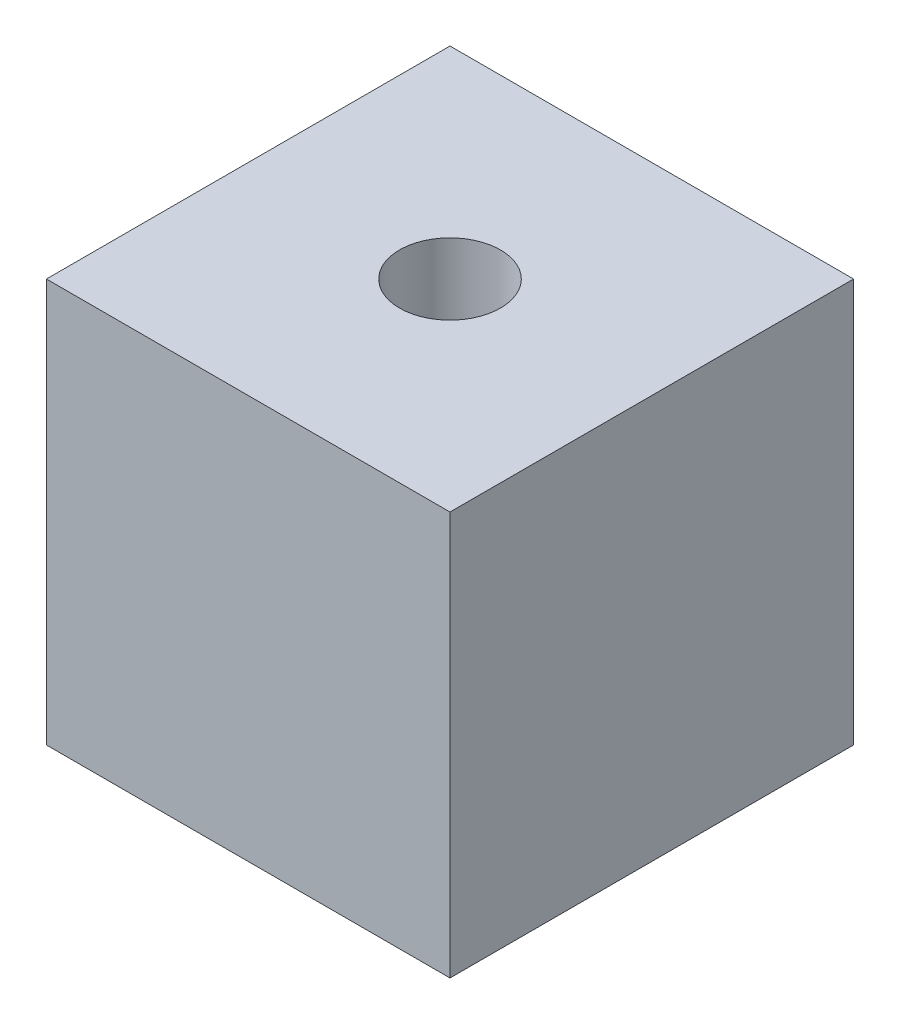
ISO-10303-21;
HEADER;
FILE_DESCRIPTION(('STEP AP214'),'2;1');
FILE_NAME('part.step','',(''),(''),'','','');
FILE_SCHEMA(('AUTOMOTIVE_DESIGN { 1 0 10303 214 1 1 1 1 }'));
ENDSEC;
DATA;
#1=APPLICATION_CONTEXT('core data for automotive mechanical design processes');
#2=APPLICATION_PROTOCOL_DEFINITION('international standard','automotive_design',2000,#1);
#3=PRODUCT_CONTEXT('',#1,'mechanical');
#4=PRODUCT('Part','Part','',(#3));
#5=PRODUCT_RELATED_PRODUCT_CATEGORY('part','',(#4));
#6=PRODUCT_DEFINITION_FORMATION('','',#4);
#7=PRODUCT_DEFINITION_CONTEXT('part definition',#1,'design');
#8=PRODUCT_DEFINITION('design','',#6,#7);
#9=PRODUCT_DEFINITION_SHAPE('','',#8);
#10=(LENGTH_UNIT() NAMED_UNIT(*) SI_UNIT(.MILLI.,.METRE.));
#11=(NAMED_UNIT(*) PLANE_ANGLE_UNIT() SI_UNIT($,.RADIAN.));
#12=(NAMED_UNIT(*) SI_UNIT($,.STERADIAN.) SOLID_ANGLE_UNIT());
#13=UNCERTAINTY_MEASURE_WITH_UNIT(LENGTH_MEASURE(1.E-05),#10,'distance_accuracy_value','');
#14=(GEOMETRIC_REPRESENTATION_CONTEXT(3) GLOBAL_UNCERTAINTY_ASSIGNED_CONTEXT((#13)) GLOBAL_UNIT_ASSIGNED_CONTEXT((#10,
#11,#12)) REPRESENTATION_CONTEXT('',''));
#15=CARTESIAN_POINT('',(0.,0.,0.));
#16=DIRECTION('',(0.,0.,1.));
#17=DIRECTION('',(1.,0.,0.));
#18=AXIS2_PLACEMENT_3D('',#15,#16,#17);
#19=CARTESIAN_POINT('',(0.,20.,0.));
#20=DIRECTION('',(0.,1.,0.));
#21=DIRECTION('',(0.,0.,1.));
#22=AXIS2_PLACEMENT_3D('',#19,#20,#21);
#23=PLANE('',#22);
#24=DIRECTION('',(0.,0.,1.));
#25=VECTOR('',#24,1.);
#26=CARTESIAN_POINT('',(0.,20.,0.));
#27=LINE('',#26,#25);
#28=CARTESIAN_POINT('',(0.,20.,0.));
#29=VERTEX_POINT('',#28);
#30=CARTESIAN_POINT('',(0.,20.,20.));
#31=VERTEX_POINT('',#30);
#32=EDGE_CURVE('E85',#29,#31,#27,.T.);
#33=ORIENTED_EDGE('',*,*,#32,.T.);
#34=DIRECTION('',(1.,0.,0.));
#35=VECTOR('',#34,1.);
#36=CARTESIAN_POINT('',(0.,20.,20.));
#37=LINE('',#36,#35);
#38=CARTESIAN_POINT('',(20.,20.,20.));
#39=VERTEX_POINT('',#38);
#40=EDGE_CURVE('E80',#31,#39,#37,.T.);
#41=ORIENTED_EDGE('',*,*,#40,.T.);
#42=DIRECTION('',(0.,0.,-1.));
#43=VECTOR('',#42,1.);
#44=CARTESIAN_POINT('',(20.,20.,0.));
#45=LINE('',#44,#43);
#46=CARTESIAN_POINT('',(20.,20.,0.));
#47=VERTEX_POINT('',#46);
#48=EDGE_CURVE('E83',#39,#47,#45,.T.);
#49=ORIENTED_EDGE('',*,*,#48,.T.);
#50=DIRECTION('',(-1.,0.,0.));
#51=VECTOR('',#50,1.);
#52=CARTESIAN_POINT('',(0.,20.,0.));
#53=LINE('',#52,#51);
#54=EDGE_CURVE('E50',#47,#29,#53,.T.);
#55=ORIENTED_EDGE('',*,*,#54,.T.);
#56=EDGE_LOOP('',(#33,#41,#49,#55));
#57=FACE_BOUND('',#56,.T.);
#58=CARTESIAN_POINT('',(10.,20.,10.));
#59=DIRECTION('',(0.,1.,0.));
#60=DIRECTION('',(0.,0.,1.));
#61=AXIS2_PLACEMENT_3D('',#58,#59,#60);
#62=CIRCLE('',#61,2.5);
#63=CARTESIAN_POINT('',(10.,20.,12.5));
#64=VERTEX_POINT('',#63);
#65=EDGE_CURVE('E100',#64,#64,#62,.T.);
#66=ORIENTED_EDGE('',*,*,#65,.F.);
#67=EDGE_LOOP('',(#66));
#68=FACE_BOUND('',#67,.T.);
#69=ADVANCED_FACE('F33',(#57,#68),#23,.T.);
#70=CARTESIAN_POINT('',(0.,0.,0.));
#71=DIRECTION('',(0.,1.,0.));
#72=DIRECTION('',(0.,0.,1.));
#73=AXIS2_PLACEMENT_3D('',#70,#71,#72);
#74=PLANE('',#73);
#75=DIRECTION('',(0.,0.,1.));
#76=VECTOR('',#75,1.);
#77=CARTESIAN_POINT('',(0.,0.,0.));
#78=LINE('',#77,#76);
#79=CARTESIAN_POINT('',(0.,0.,0.));
#80=VERTEX_POINT('',#79);
#81=CARTESIAN_POINT('',(0.,0.,20.));
#82=VERTEX_POINT('',#81);
#83=EDGE_CURVE('E97',#80,#82,#78,.T.);
#84=ORIENTED_EDGE('',*,*,#83,.F.);
#85=DIRECTION('',(-1.,0.,0.));
#86=VECTOR('',#85,1.);
#87=CARTESIAN_POINT('',(0.,0.,0.));
#88=LINE('',#87,#86);
#89=CARTESIAN_POINT('',(20.,0.,0.));
#90=VERTEX_POINT('',#89);
#91=EDGE_CURVE('E73',#90,#80,#88,.T.);
#92=ORIENTED_EDGE('',*,*,#91,.F.);
#93=DIRECTION('',(0.,0.,-1.));
#94=VECTOR('',#93,1.);
#95=CARTESIAN_POINT('',(20.,0.,0.));
#96=LINE('',#95,#94);
#97=CARTESIAN_POINT('',(20.,0.,20.));
#98=VERTEX_POINT('',#97);
#99=EDGE_CURVE('E67',#98,#90,#96,.T.);
#100=ORIENTED_EDGE('',*,*,#99,.F.);
#101=DIRECTION('',(1.,0.,0.));
#102=VECTOR('',#101,1.);
#103=CARTESIAN_POINT('',(0.,0.,20.));
#104=LINE('',#103,#102);
#105=EDGE_CURVE('E89',#82,#98,#104,.T.);
#106=ORIENTED_EDGE('',*,*,#105,.F.);
#107=EDGE_LOOP('',(#84,#92,#100,#106));
#108=FACE_BOUND('',#107,.T.);
#109=CARTESIAN_POINT('',(10.,0.,10.));
#110=DIRECTION('',(0.,1.,0.));
#111=DIRECTION('',(0.,0.,1.));
#112=AXIS2_PLACEMENT_3D('',#109,#110,#111);
#113=CIRCLE('',#112,2.5);
#114=CARTESIAN_POINT('',(10.,0.,12.5));
#115=VERTEX_POINT('',#114);
#116=EDGE_CURVE('E112',#115,#115,#113,.T.);
#117=ORIENTED_EDGE('',*,*,#116,.T.);
#118=EDGE_LOOP('',(#117));
#119=FACE_BOUND('',#118,.T.);
#120=ADVANCED_FACE('F108',(#108,#119),#74,.F.);
#121=CARTESIAN_POINT('',(0.,20.,0.));
#122=DIRECTION('',(1.,0.,0.));
#123=DIRECTION('',(0.,0.,-1.));
#124=AXIS2_PLACEMENT_3D('',#121,#122,#123);
#125=PLANE('',#124);
#126=ORIENTED_EDGE('',*,*,#83,.T.);
#127=DIRECTION('',(0.,-1.,0.));
#128=VECTOR('',#127,1.);
#129=CARTESIAN_POINT('',(0.,20.,20.));
#130=LINE('',#129,#128);
#131=EDGE_CURVE('E11',#31,#82,#130,.T.);
#132=ORIENTED_EDGE('',*,*,#131,.F.);
#133=ORIENTED_EDGE('',*,*,#32,.F.);
#134=DIRECTION('',(0.,-1.,0.));
#135=VECTOR('',#134,1.);
#136=CARTESIAN_POINT('',(0.,20.,0.));
#137=LINE('',#136,#135);
#138=EDGE_CURVE('E93',#29,#80,#137,.T.);
#139=ORIENTED_EDGE('',*,*,#138,.T.);
#140=EDGE_LOOP('',(#126,#132,#133,#139));
#141=FACE_BOUND('',#140,.T.);
#142=ADVANCED_FACE('F35',(#141),#125,.F.);
#143=CARTESIAN_POINT('',(0.,20.,20.));
#144=DIRECTION('',(0.,0.,-1.));
#145=DIRECTION('',(-1.,0.,0.));
#146=AXIS2_PLACEMENT_3D('',#143,#144,#145);
#147=PLANE('',#146);
#148=ORIENTED_EDGE('',*,*,#105,.T.);
#149=DIRECTION('',(0.,-1.,0.));
#150=VECTOR('',#149,1.);
#151=CARTESIAN_POINT('',(20.,20.,20.));
#152=LINE('',#151,#150);
#153=EDGE_CURVE('E42',#39,#98,#152,.T.);
#154=ORIENTED_EDGE('',*,*,#153,.F.);
#155=ORIENTED_EDGE('',*,*,#40,.F.);
#156=ORIENTED_EDGE('',*,*,#131,.T.);
#157=EDGE_LOOP('',(#148,#154,#155,#156));
#158=FACE_BOUND('',#157,.T.);
#159=ADVANCED_FACE('F88',(#158),#147,.F.);
#160=CARTESIAN_POINT('',(20.,20.,0.));
#161=DIRECTION('',(-1.,0.,0.));
#162=DIRECTION('',(0.,0.,1.));
#163=AXIS2_PLACEMENT_3D('',#160,#161,#162);
#164=PLANE('',#163);
#165=ORIENTED_EDGE('',*,*,#99,.T.);
#166=DIRECTION('',(0.,-1.,0.));
#167=VECTOR('',#166,1.);
#168=CARTESIAN_POINT('',(20.,20.,0.));
#169=LINE('',#168,#167);
#170=EDGE_CURVE('E90',#47,#90,#169,.T.);
#171=ORIENTED_EDGE('',*,*,#170,.F.);
#172=ORIENTED_EDGE('',*,*,#48,.F.);
#173=ORIENTED_EDGE('',*,*,#153,.T.);
#174=EDGE_LOOP('',(#165,#171,#172,#173));
#175=FACE_BOUND('',#174,.T.);
#176=ADVANCED_FACE('F91',(#175),#164,.F.);
#177=CARTESIAN_POINT('',(0.,20.,0.));
#178=DIRECTION('',(0.,0.,1.));
#179=DIRECTION('',(1.,0.,0.));
#180=AXIS2_PLACEMENT_3D('',#177,#178,#179);
#181=PLANE('',#180);
#182=ORIENTED_EDGE('',*,*,#91,.T.);
#183=ORIENTED_EDGE('',*,*,#138,.F.);
#184=ORIENTED_EDGE('',*,*,#54,.F.);
#185=ORIENTED_EDGE('',*,*,#170,.T.);
#186=EDGE_LOOP('',(#182,#183,#184,#185));
#187=FACE_BOUND('',#186,.T.);
#188=ADVANCED_FACE('F105',(#187),#181,.F.);
#189=CARTESIAN_POINT('',(10.,20.,10.));
#190=DIRECTION('',(0.,-1.,0.));
#191=DIRECTION('',(0.,0.,-1.));
#192=AXIS2_PLACEMENT_3D('',#189,#190,#191);
#193=CYLINDRICAL_SURFACE('',#192,2.5);
#194=ORIENTED_EDGE('',*,*,#65,.T.);
#195=EDGE_LOOP('',(#194));
#196=FACE_BOUND('',#195,.T.);
#197=ORIENTED_EDGE('',*,*,#116,.F.);
#198=EDGE_LOOP('',(#197));
#199=FACE_BOUND('',#198,.T.);
#200=ADVANCED_FACE('F118',(#196,#199),#193,.F.);
#201=CLOSED_SHELL('',(#69,#120,#142,#159,#176,#188,#200));
#202=MANIFOLD_SOLID_BREP('B2',#201);
#203=ADVANCED_BREP_SHAPE_REPRESENTATION('',(#18,#202),#14);
#204=SHAPE_DEFINITION_REPRESENTATION(#9,#203);
ENDSEC;
END-ISO-10303-21;
